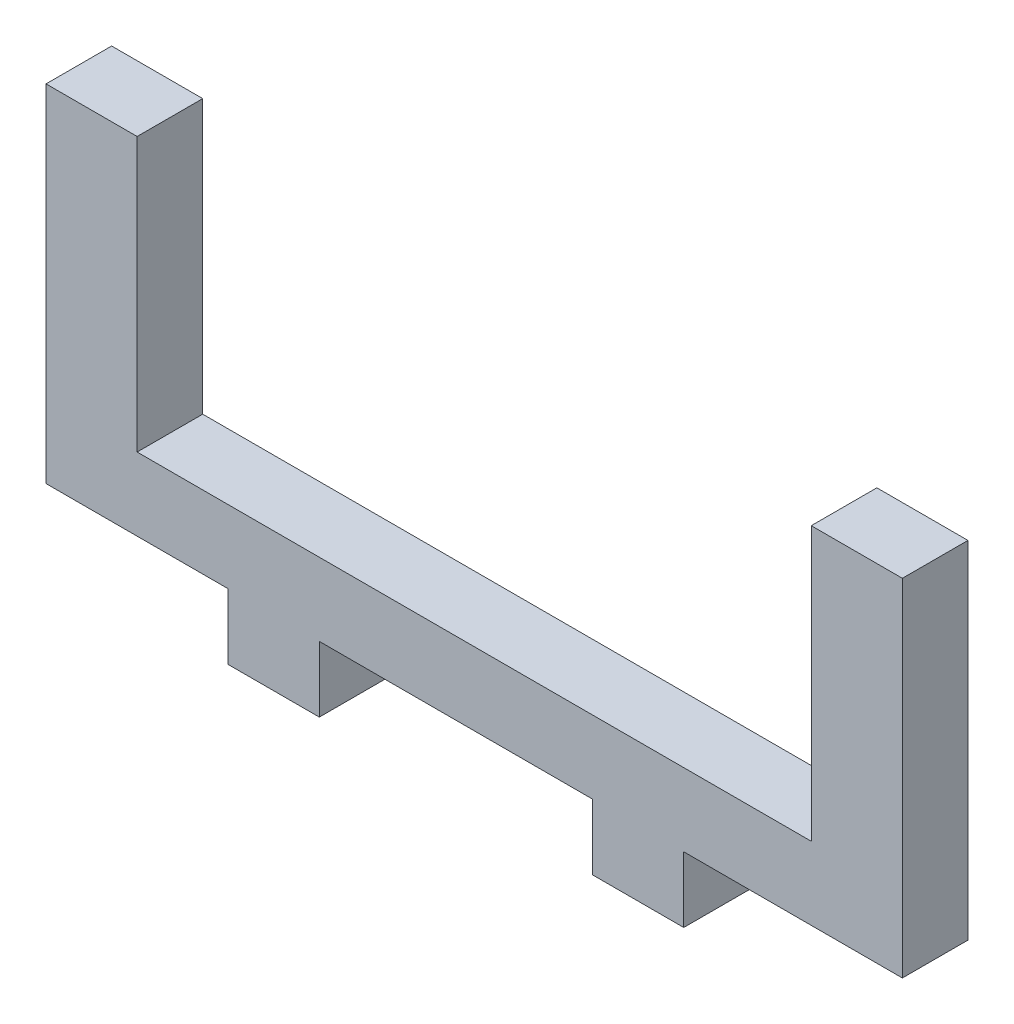
ISO-10303-21;
HEADER;
FILE_DESCRIPTION(('STEP AP214'),'2;1');
FILE_NAME('part.step','',(''),(''),'','','');
FILE_SCHEMA(('AUTOMOTIVE_DESIGN { 1 0 10303 214 1 1 1 1 }'));
ENDSEC;
DATA;
#1=APPLICATION_CONTEXT('core data for automotive mechanical design processes');
#2=APPLICATION_PROTOCOL_DEFINITION('international standard','automotive_design',2000,#1);
#3=PRODUCT_CONTEXT('',#1,'mechanical');
#4=PRODUCT('Part','Part','',(#3));
#5=PRODUCT_RELATED_PRODUCT_CATEGORY('part','',(#4));
#6=PRODUCT_DEFINITION_FORMATION('','',#4);
#7=PRODUCT_DEFINITION_CONTEXT('part definition',#1,'design');
#8=PRODUCT_DEFINITION('design','',#6,#7);
#9=PRODUCT_DEFINITION_SHAPE('','',#8);
#10=(LENGTH_UNIT() NAMED_UNIT(*) SI_UNIT(.MILLI.,.METRE.));
#11=(NAMED_UNIT(*) PLANE_ANGLE_UNIT() SI_UNIT($,.RADIAN.));
#12=(NAMED_UNIT(*) SI_UNIT($,.STERADIAN.) SOLID_ANGLE_UNIT());
#13=UNCERTAINTY_MEASURE_WITH_UNIT(LENGTH_MEASURE(1.E-05),#10,'distance_accuracy_value','');
#14=(GEOMETRIC_REPRESENTATION_CONTEXT(3) GLOBAL_UNCERTAINTY_ASSIGNED_CONTEXT((#13)) GLOBAL_UNIT_ASSIGNED_CONTEXT((#10,
#11,#12)) REPRESENTATION_CONTEXT('',''));
#15=CARTESIAN_POINT('',(0.,0.,0.));
#16=DIRECTION('',(0.,0.,1.));
#17=DIRECTION('',(1.,0.,0.));
#18=AXIS2_PLACEMENT_3D('',#15,#16,#17);
#19=CARTESIAN_POINT('',(0.,-5.08,4.572));
#20=DIRECTION('',(0.,1.,0.));
#21=DIRECTION('',(0.,0.,1.));
#22=AXIS2_PLACEMENT_3D('',#19,#20,#21);
#23=PLANE('',#22);
#24=DIRECTION('',(0.,0.,-1.));
#25=VECTOR('',#24,1.);
#26=CARTESIAN_POINT('',(38.1,-5.08,4.572));
#27=LINE('',#26,#25);
#28=CARTESIAN_POINT('',(38.1,-5.08,4.572));
#29=VERTEX_POINT('',#28);
#30=CARTESIAN_POINT('',(38.1,-5.08,0.));
#31=VERTEX_POINT('',#30);
#32=EDGE_CURVE('E12',#29,#31,#27,.T.);
#33=ORIENTED_EDGE('',*,*,#32,.F.);
#34=DIRECTION('',(1.,0.,0.));
#35=VECTOR('',#34,1.);
#36=CARTESIAN_POINT('',(0.,-5.08,4.572));
#37=LINE('',#36,#35);
#38=CARTESIAN_POINT('',(19.05,-5.08,4.572));
#39=VERTEX_POINT('',#38);
#40=EDGE_CURVE('E246',#39,#29,#37,.T.);
#41=ORIENTED_EDGE('',*,*,#40,.F.);
#42=DIRECTION('',(0.,0.,-1.));
#43=VECTOR('',#42,1.);
#44=CARTESIAN_POINT('',(19.05,-5.08,4.572));
#45=LINE('',#44,#43);
#46=CARTESIAN_POINT('',(19.05,-5.08,0.));
#47=VERTEX_POINT('',#46);
#48=EDGE_CURVE('E162',#39,#47,#45,.T.);
#49=ORIENTED_EDGE('',*,*,#48,.T.);
#50=DIRECTION('',(1.,0.,0.));
#51=VECTOR('',#50,1.);
#52=CARTESIAN_POINT('',(0.,-5.08,0.));
#53=LINE('',#52,#51);
#54=EDGE_CURVE('E212',#47,#31,#53,.T.);
#55=ORIENTED_EDGE('',*,*,#54,.T.);
#56=EDGE_LOOP('',(#33,#41,#49,#55));
#57=FACE_BOUND('',#56,.T.);
#58=ADVANCED_FACE('F83',(#57),#23,.F.);
#59=CARTESIAN_POINT('',(0.,-5.08,4.572));
#60=DIRECTION('',(0.,1.,0.));
#61=DIRECTION('',(0.,0.,1.));
#62=AXIS2_PLACEMENT_3D('',#59,#60,#61);
#63=PLANE('',#62);
#64=DIRECTION('',(1.,0.,0.));
#65=VECTOR('',#64,1.);
#66=CARTESIAN_POINT('',(0.,-5.08,0.));
#67=LINE('',#66,#65);
#68=CARTESIAN_POINT('',(0.,-5.08,0.));
#69=VERTEX_POINT('',#68);
#70=CARTESIAN_POINT('',(12.7,-5.08,0.));
#71=VERTEX_POINT('',#70);
#72=EDGE_CURVE('E140',#69,#71,#67,.T.);
#73=ORIENTED_EDGE('',*,*,#72,.T.);
#74=DIRECTION('',(0.,0.,-1.));
#75=VECTOR('',#74,1.);
#76=CARTESIAN_POINT('',(12.7,-5.08,4.572));
#77=LINE('',#76,#75);
#78=CARTESIAN_POINT('',(12.7,-5.08,4.572));
#79=VERTEX_POINT('',#78);
#80=EDGE_CURVE('E153',#79,#71,#77,.T.);
#81=ORIENTED_EDGE('',*,*,#80,.F.);
#82=DIRECTION('',(1.,0.,0.));
#83=VECTOR('',#82,1.);
#84=CARTESIAN_POINT('',(0.,-5.08,4.572));
#85=LINE('',#84,#83);
#86=CARTESIAN_POINT('',(0.,-5.08,4.572));
#87=VERTEX_POINT('',#86);
#88=EDGE_CURVE('E193',#87,#79,#85,.T.);
#89=ORIENTED_EDGE('',*,*,#88,.F.);
#90=DIRECTION('',(0.,0.,-1.));
#91=VECTOR('',#90,1.);
#92=CARTESIAN_POINT('',(0.,-5.08,4.572));
#93=LINE('',#92,#91);
#94=EDGE_CURVE('E186',#87,#69,#93,.T.);
#95=ORIENTED_EDGE('',*,*,#94,.T.);
#96=EDGE_LOOP('',(#73,#81,#89,#95));
#97=FACE_BOUND('',#96,.T.);
#98=ADVANCED_FACE('F275',(#97),#63,.F.);
#99=CARTESIAN_POINT('',(12.7,0.,4.572));
#100=DIRECTION('',(1.,0.,0.));
#101=DIRECTION('',(0.,0.,-1.));
#102=AXIS2_PLACEMENT_3D('',#99,#100,#101);
#103=PLANE('',#102);
#104=DIRECTION('',(0.,-1.,0.));
#105=VECTOR('',#104,1.);
#106=CARTESIAN_POINT('',(12.7,0.,0.));
#107=LINE('',#106,#105);
#108=CARTESIAN_POINT('',(12.7,-9.652,0.));
#109=VERTEX_POINT('',#108);
#110=EDGE_CURVE('E221',#71,#109,#107,.T.);
#111=ORIENTED_EDGE('',*,*,#110,.T.);
#112=DIRECTION('',(0.,0.,-1.));
#113=VECTOR('',#112,1.);
#114=CARTESIAN_POINT('',(12.7,-9.652,4.572));
#115=LINE('',#114,#113);
#116=CARTESIAN_POINT('',(12.7,-9.652,4.572));
#117=VERTEX_POINT('',#116);
#118=EDGE_CURVE('E156',#117,#109,#115,.T.);
#119=ORIENTED_EDGE('',*,*,#118,.F.);
#120=DIRECTION('',(0.,-1.,0.));
#121=VECTOR('',#120,1.);
#122=CARTESIAN_POINT('',(12.7,0.,4.572));
#123=LINE('',#122,#121);
#124=EDGE_CURVE('E256',#79,#117,#123,.T.);
#125=ORIENTED_EDGE('',*,*,#124,.F.);
#126=ORIENTED_EDGE('',*,*,#80,.T.);
#127=EDGE_LOOP('',(#111,#119,#125,#126));
#128=FACE_BOUND('',#127,.T.);
#129=ADVANCED_FACE('F277',(#128),#103,.F.);
#130=CARTESIAN_POINT('',(0.,-9.652,4.572));
#131=DIRECTION('',(0.,1.,0.));
#132=DIRECTION('',(0.,0.,1.));
#133=AXIS2_PLACEMENT_3D('',#130,#131,#132);
#134=PLANE('',#133);
#135=DIRECTION('',(1.,0.,0.));
#136=VECTOR('',#135,1.);
#137=CARTESIAN_POINT('',(0.,-9.652,0.));
#138=LINE('',#137,#136);
#139=CARTESIAN_POINT('',(19.05,-9.652,0.));
#140=VERTEX_POINT('',#139);
#141=EDGE_CURVE('E218',#109,#140,#138,.T.);
#142=ORIENTED_EDGE('',*,*,#141,.T.);
#143=DIRECTION('',(0.,0.,-1.));
#144=VECTOR('',#143,1.);
#145=CARTESIAN_POINT('',(19.05,-9.652,4.572));
#146=LINE('',#145,#144);
#147=CARTESIAN_POINT('',(19.05,-9.652,4.572));
#148=VERTEX_POINT('',#147);
#149=EDGE_CURVE('E159',#148,#140,#146,.T.);
#150=ORIENTED_EDGE('',*,*,#149,.F.);
#151=DIRECTION('',(1.,0.,0.));
#152=VECTOR('',#151,1.);
#153=CARTESIAN_POINT('',(0.,-9.652,4.572));
#154=LINE('',#153,#152);
#155=EDGE_CURVE('E253',#117,#148,#154,.T.);
#156=ORIENTED_EDGE('',*,*,#155,.F.);
#157=ORIENTED_EDGE('',*,*,#118,.T.);
#158=EDGE_LOOP('',(#142,#150,#156,#157));
#159=FACE_BOUND('',#158,.T.);
#160=ADVANCED_FACE('F381',(#159),#134,.F.);
#161=CARTESIAN_POINT('',(19.05,0.,4.572));
#162=DIRECTION('',(1.,0.,0.));
#163=DIRECTION('',(0.,0.,-1.));
#164=AXIS2_PLACEMENT_3D('',#161,#162,#163);
#165=PLANE('',#164);
#166=DIRECTION('',(0.,-1.,0.));
#167=VECTOR('',#166,1.);
#168=CARTESIAN_POINT('',(19.05,0.,0.));
#169=LINE('',#168,#167);
#170=EDGE_CURVE('E215',#47,#140,#169,.T.);
#171=ORIENTED_EDGE('',*,*,#170,.F.);
#172=ORIENTED_EDGE('',*,*,#48,.F.);
#173=DIRECTION('',(0.,-1.,0.));
#174=VECTOR('',#173,1.);
#175=CARTESIAN_POINT('',(19.05,0.,4.572));
#176=LINE('',#175,#174);
#177=EDGE_CURVE('E250',#39,#148,#176,.T.);
#178=ORIENTED_EDGE('',*,*,#177,.T.);
#179=ORIENTED_EDGE('',*,*,#149,.T.);
#180=EDGE_LOOP('',(#171,#172,#178,#179));
#181=FACE_BOUND('',#180,.T.);
#182=ADVANCED_FACE('F384',(#181),#165,.T.);
#183=CARTESIAN_POINT('',(44.45,-5.08,4.572));
#184=VERTEX_POINT('',#183);
#185=CARTESIAN_POINT('',(59.69,-5.08,4.572));
#186=VERTEX_POINT('',#185);
#187=EDGE_CURVE('E249',#184,#186,#37,.T.);
#188=ORIENTED_EDGE('',*,*,#187,.F.);
#189=DIRECTION('',(0.,0.,-1.));
#190=VECTOR('',#189,1.);
#191=CARTESIAN_POINT('',(44.45,-5.08,4.572));
#192=LINE('',#191,#190);
#193=CARTESIAN_POINT('',(44.45,-5.08,0.));
#194=VERTEX_POINT('',#193);
#195=EDGE_CURVE('E93',#184,#194,#192,.T.);
#196=ORIENTED_EDGE('',*,*,#195,.T.);
#197=CARTESIAN_POINT('',(59.69,-5.08,0.));
#198=VERTEX_POINT('',#197);
#199=EDGE_CURVE('E214',#194,#198,#53,.T.);
#200=ORIENTED_EDGE('',*,*,#199,.T.);
#201=DIRECTION('',(0.,0.,-1.));
#202=VECTOR('',#201,1.);
#203=CARTESIAN_POINT('',(59.69,-5.08,4.572));
#204=LINE('',#203,#202);
#205=EDGE_CURVE('E165',#186,#198,#204,.T.);
#206=ORIENTED_EDGE('',*,*,#205,.F.);
#207=EDGE_LOOP('',(#188,#196,#200,#206));
#208=FACE_BOUND('',#207,.T.);
#209=ADVANCED_FACE('F308',(#208),#23,.F.);
#210=CARTESIAN_POINT('',(59.69,0.,4.572));
#211=DIRECTION('',(1.,0.,0.));
#212=DIRECTION('',(0.,0.,-1.));
#213=AXIS2_PLACEMENT_3D('',#210,#211,#212);
#214=PLANE('',#213);
#215=DIRECTION('',(0.,-1.,0.));
#216=VECTOR('',#215,1.);
#217=CARTESIAN_POINT('',(59.69,0.,0.));
#218=LINE('',#217,#216);
#219=CARTESIAN_POINT('',(59.69,19.05,0.));
#220=VERTEX_POINT('',#219);
#221=EDGE_CURVE('E209',#220,#198,#218,.T.);
#222=ORIENTED_EDGE('',*,*,#221,.F.);
#223=DIRECTION('',(0.,0.,-1.));
#224=VECTOR('',#223,1.);
#225=CARTESIAN_POINT('',(59.69,19.05,4.572));
#226=LINE('',#225,#224);
#227=CARTESIAN_POINT('',(59.69,19.05,4.572));
#228=VERTEX_POINT('',#227);
#229=EDGE_CURVE('E168',#228,#220,#226,.T.);
#230=ORIENTED_EDGE('',*,*,#229,.F.);
#231=DIRECTION('',(0.,-1.,0.));
#232=VECTOR('',#231,1.);
#233=CARTESIAN_POINT('',(59.69,0.,4.572));
#234=LINE('',#233,#232);
#235=EDGE_CURVE('E243',#228,#186,#234,.T.);
#236=ORIENTED_EDGE('',*,*,#235,.T.);
#237=ORIENTED_EDGE('',*,*,#205,.T.);
#238=EDGE_LOOP('',(#222,#230,#236,#237));
#239=FACE_BOUND('',#238,.T.);
#240=ADVANCED_FACE('F315',(#239),#214,.T.);
#241=CARTESIAN_POINT('',(0.,19.05,4.572));
#242=DIRECTION('',(0.,-1.,0.));
#243=DIRECTION('',(0.,0.,-1.));
#244=AXIS2_PLACEMENT_3D('',#241,#242,#243);
#245=PLANE('',#244);
#246=DIRECTION('',(-1.,0.,0.));
#247=VECTOR('',#246,1.);
#248=CARTESIAN_POINT('',(0.,19.05,0.));
#249=LINE('',#248,#247);
#250=CARTESIAN_POINT('',(53.34,19.05,0.));
#251=VERTEX_POINT('',#250);
#252=EDGE_CURVE('E206',#220,#251,#249,.T.);
#253=ORIENTED_EDGE('',*,*,#252,.T.);
#254=DIRECTION('',(0.,0.,-1.));
#255=VECTOR('',#254,1.);
#256=CARTESIAN_POINT('',(53.34,19.05,4.572));
#257=LINE('',#256,#255);
#258=CARTESIAN_POINT('',(53.34,19.05,4.572));
#259=VERTEX_POINT('',#258);
#260=EDGE_CURVE('E171',#259,#251,#257,.T.);
#261=ORIENTED_EDGE('',*,*,#260,.F.);
#262=DIRECTION('',(-1.,0.,0.));
#263=VECTOR('',#262,1.);
#264=CARTESIAN_POINT('',(0.,19.05,4.572));
#265=LINE('',#264,#263);
#266=EDGE_CURVE('E240',#228,#259,#265,.T.);
#267=ORIENTED_EDGE('',*,*,#266,.F.);
#268=ORIENTED_EDGE('',*,*,#229,.T.);
#269=EDGE_LOOP('',(#253,#261,#267,#268));
#270=FACE_BOUND('',#269,.T.);
#271=ADVANCED_FACE('F360',(#270),#245,.F.);
#272=CARTESIAN_POINT('',(53.34,0.,4.572));
#273=DIRECTION('',(-1.,0.,0.));
#274=DIRECTION('',(0.,0.,1.));
#275=AXIS2_PLACEMENT_3D('',#272,#273,#274);
#276=PLANE('',#275);
#277=DIRECTION('',(0.,1.,0.));
#278=VECTOR('',#277,1.);
#279=CARTESIAN_POINT('',(53.34,0.,0.));
#280=LINE('',#279,#278);
#281=CARTESIAN_POINT('',(53.34,0.,0.));
#282=VERTEX_POINT('',#281);
#283=EDGE_CURVE('E203',#282,#251,#280,.T.);
#284=ORIENTED_EDGE('',*,*,#283,.F.);
#285=DIRECTION('',(0.,0.,-1.));
#286=VECTOR('',#285,1.);
#287=CARTESIAN_POINT('',(53.34,0.,4.572));
#288=LINE('',#287,#286);
#289=CARTESIAN_POINT('',(53.34,0.,4.572));
#290=VERTEX_POINT('',#289);
#291=EDGE_CURVE('E174',#290,#282,#288,.T.);
#292=ORIENTED_EDGE('',*,*,#291,.F.);
#293=DIRECTION('',(0.,1.,0.));
#294=VECTOR('',#293,1.);
#295=CARTESIAN_POINT('',(53.34,0.,4.572));
#296=LINE('',#295,#294);
#297=EDGE_CURVE('E237',#290,#259,#296,.T.);
#298=ORIENTED_EDGE('',*,*,#297,.T.);
#299=ORIENTED_EDGE('',*,*,#260,.T.);
#300=EDGE_LOOP('',(#284,#292,#298,#299));
#301=FACE_BOUND('',#300,.T.);
#302=ADVANCED_FACE('F357',(#301),#276,.T.);
#303=CARTESIAN_POINT('',(0.,0.,4.572));
#304=DIRECTION('',(0.,1.,0.));
#305=DIRECTION('',(0.,0.,1.));
#306=AXIS2_PLACEMENT_3D('',#303,#304,#305);
#307=PLANE('',#306);
#308=DIRECTION('',(1.,0.,0.));
#309=VECTOR('',#308,1.);
#310=CARTESIAN_POINT('',(0.,0.,0.));
#311=LINE('',#310,#309);
#312=CARTESIAN_POINT('',(6.35,0.,0.));
#313=VERTEX_POINT('',#312);
#314=EDGE_CURVE('E200',#313,#282,#311,.T.);
#315=ORIENTED_EDGE('',*,*,#314,.F.);
#316=DIRECTION('',(0.,0.,-1.));
#317=VECTOR('',#316,1.);
#318=CARTESIAN_POINT('',(6.35,0.,4.572));
#319=LINE('',#318,#317);
#320=CARTESIAN_POINT('',(6.35,0.,4.572));
#321=VERTEX_POINT('',#320);
#322=EDGE_CURVE('E177',#321,#313,#319,.T.);
#323=ORIENTED_EDGE('',*,*,#322,.F.);
#324=DIRECTION('',(1.,0.,0.));
#325=VECTOR('',#324,1.);
#326=CARTESIAN_POINT('',(0.,0.,4.572));
#327=LINE('',#326,#325);
#328=EDGE_CURVE('E234',#321,#290,#327,.T.);
#329=ORIENTED_EDGE('',*,*,#328,.T.);
#330=ORIENTED_EDGE('',*,*,#291,.T.);
#331=EDGE_LOOP('',(#315,#323,#329,#330));
#332=FACE_BOUND('',#331,.T.);
#333=ADVANCED_FACE('F354',(#332),#307,.T.);
#334=CARTESIAN_POINT('',(6.35,0.,4.572));
#335=DIRECTION('',(-1.,0.,0.));
#336=DIRECTION('',(0.,0.,1.));
#337=AXIS2_PLACEMENT_3D('',#334,#335,#336);
#338=PLANE('',#337);
#339=DIRECTION('',(0.,1.,0.));
#340=VECTOR('',#339,1.);
#341=CARTESIAN_POINT('',(6.35,0.,0.));
#342=LINE('',#341,#340);
#343=CARTESIAN_POINT('',(6.35,19.05,0.));
#344=VERTEX_POINT('',#343);
#345=EDGE_CURVE('E197',#313,#344,#342,.T.);
#346=ORIENTED_EDGE('',*,*,#345,.T.);
#347=DIRECTION('',(0.,0.,-1.));
#348=VECTOR('',#347,1.);
#349=CARTESIAN_POINT('',(6.35,19.05,4.572));
#350=LINE('',#349,#348);
#351=CARTESIAN_POINT('',(6.35,19.05,4.572));
#352=VERTEX_POINT('',#351);
#353=EDGE_CURVE('E180',#352,#344,#350,.T.);
#354=ORIENTED_EDGE('',*,*,#353,.F.);
#355=DIRECTION('',(0.,1.,0.));
#356=VECTOR('',#355,1.);
#357=CARTESIAN_POINT('',(6.35,0.,4.572));
#358=LINE('',#357,#356);
#359=EDGE_CURVE('E231',#321,#352,#358,.T.);
#360=ORIENTED_EDGE('',*,*,#359,.F.);
#361=ORIENTED_EDGE('',*,*,#322,.T.);
#362=EDGE_LOOP('',(#346,#354,#360,#361));
#363=FACE_BOUND('',#362,.T.);
#364=ADVANCED_FACE('F350',(#363),#338,.F.);
#365=CARTESIAN_POINT('',(0.,19.05,4.572));
#366=DIRECTION('',(0.,1.,0.));
#367=DIRECTION('',(0.,0.,1.));
#368=AXIS2_PLACEMENT_3D('',#365,#366,#367);
#369=PLANE('',#368);
#370=DIRECTION('',(1.,0.,0.));
#371=VECTOR('',#370,1.);
#372=CARTESIAN_POINT('',(0.,19.05,0.));
#373=LINE('',#372,#371);
#374=CARTESIAN_POINT('',(0.,19.05,0.));
#375=VERTEX_POINT('',#374);
#376=EDGE_CURVE('E194',#375,#344,#373,.T.);
#377=ORIENTED_EDGE('',*,*,#376,.F.);
#378=DIRECTION('',(0.,0.,-1.));
#379=VECTOR('',#378,1.);
#380=CARTESIAN_POINT('',(0.,19.05,4.572));
#381=LINE('',#380,#379);
#382=CARTESIAN_POINT('',(0.,19.05,4.572));
#383=VERTEX_POINT('',#382);
#384=EDGE_CURVE('E183',#383,#375,#381,.T.);
#385=ORIENTED_EDGE('',*,*,#384,.F.);
#386=DIRECTION('',(1.,0.,0.));
#387=VECTOR('',#386,1.);
#388=CARTESIAN_POINT('',(0.,19.05,4.572));
#389=LINE('',#388,#387);
#390=EDGE_CURVE('E228',#383,#352,#389,.T.);
#391=ORIENTED_EDGE('',*,*,#390,.T.);
#392=ORIENTED_EDGE('',*,*,#353,.T.);
#393=EDGE_LOOP('',(#377,#385,#391,#392));
#394=FACE_BOUND('',#393,.T.);
#395=ADVANCED_FACE('F341',(#394),#369,.T.);
#396=CARTESIAN_POINT('',(0.,0.,4.572));
#397=DIRECTION('',(1.,0.,0.));
#398=DIRECTION('',(0.,1.,0.));
#399=AXIS2_PLACEMENT_3D('',#396,#397,#398);
#400=PLANE('',#399);
#401=DIRECTION('',(0.,-1.,0.));
#402=VECTOR('',#401,1.);
#403=CARTESIAN_POINT('',(0.,0.,0.));
#404=LINE('',#403,#402);
#405=EDGE_CURVE('E190',#375,#69,#404,.T.);
#406=ORIENTED_EDGE('',*,*,#405,.T.);
#407=ORIENTED_EDGE('',*,*,#94,.F.);
#408=DIRECTION('',(0.,-1.,0.));
#409=VECTOR('',#408,1.);
#410=CARTESIAN_POINT('',(0.,0.,4.572));
#411=LINE('',#410,#409);
#412=EDGE_CURVE('E189',#383,#87,#411,.T.);
#413=ORIENTED_EDGE('',*,*,#412,.F.);
#414=ORIENTED_EDGE('',*,*,#384,.T.);
#415=EDGE_LOOP('',(#406,#407,#413,#414));
#416=FACE_BOUND('',#415,.T.);
#417=ADVANCED_FACE('F344',(#416),#400,.F.);
#418=CARTESIAN_POINT('',(0.,0.,4.572));
#419=DIRECTION('',(0.,0.,1.));
#420=DIRECTION('',(1.,0.,0.));
#421=AXIS2_PLACEMENT_3D('',#418,#419,#420);
#422=PLANE('',#421);
#423=ORIENTED_EDGE('',*,*,#88,.T.);
#424=ORIENTED_EDGE('',*,*,#124,.T.);
#425=ORIENTED_EDGE('',*,*,#155,.T.);
#426=ORIENTED_EDGE('',*,*,#177,.F.);
#427=ORIENTED_EDGE('',*,*,#40,.T.);
#428=DIRECTION('',(0.,-1.,0.));
#429=VECTOR('',#428,1.);
#430=CARTESIAN_POINT('',(38.1,-5.08,4.572));
#431=LINE('',#430,#429);
#432=CARTESIAN_POINT('',(38.1,-9.652,4.572));
#433=VERTEX_POINT('',#432);
#434=EDGE_CURVE('E148',#29,#433,#431,.T.);
#435=ORIENTED_EDGE('',*,*,#434,.T.);
#436=DIRECTION('',(1.,0.,0.));
#437=VECTOR('',#436,1.);
#438=CARTESIAN_POINT('',(38.1,-9.652,4.572));
#439=LINE('',#438,#437);
#440=CARTESIAN_POINT('',(44.45,-9.652,4.572));
#441=VERTEX_POINT('',#440);
#442=EDGE_CURVE('E139',#433,#441,#439,.T.);
#443=ORIENTED_EDGE('',*,*,#442,.T.);
#444=DIRECTION('',(0.,-1.,0.));
#445=VECTOR('',#444,1.);
#446=CARTESIAN_POINT('',(44.45,-5.08,4.572));
#447=LINE('',#446,#445);
#448=EDGE_CURVE('E133',#184,#441,#447,.T.);
#449=ORIENTED_EDGE('',*,*,#448,.F.);
#450=ORIENTED_EDGE('',*,*,#187,.T.);
#451=ORIENTED_EDGE('',*,*,#235,.F.);
#452=ORIENTED_EDGE('',*,*,#266,.T.);
#453=ORIENTED_EDGE('',*,*,#297,.F.);
#454=ORIENTED_EDGE('',*,*,#328,.F.);
#455=ORIENTED_EDGE('',*,*,#359,.T.);
#456=ORIENTED_EDGE('',*,*,#390,.F.);
#457=ORIENTED_EDGE('',*,*,#412,.T.);
#458=EDGE_LOOP('',(#423,#424,#425,#426,#427,#435,#443,#449,#450,#451,#452,#453,#454,#455,#456,#457));
#459=FACE_BOUND('',#458,.T.);
#460=ADVANCED_FACE('F264',(#459),#422,.T.);
#461=CARTESIAN_POINT('',(0.,0.,0.));
#462=DIRECTION('',(0.,0.,1.));
#463=DIRECTION('',(1.,0.,0.));
#464=AXIS2_PLACEMENT_3D('',#461,#462,#463);
#465=PLANE('',#464);
#466=ORIENTED_EDGE('',*,*,#72,.F.);
#467=ORIENTED_EDGE('',*,*,#405,.F.);
#468=ORIENTED_EDGE('',*,*,#376,.T.);
#469=ORIENTED_EDGE('',*,*,#345,.F.);
#470=ORIENTED_EDGE('',*,*,#314,.T.);
#471=ORIENTED_EDGE('',*,*,#283,.T.);
#472=ORIENTED_EDGE('',*,*,#252,.F.);
#473=ORIENTED_EDGE('',*,*,#221,.T.);
#474=ORIENTED_EDGE('',*,*,#199,.F.);
#475=DIRECTION('',(0.,-1.,0.));
#476=VECTOR('',#475,1.);
#477=CARTESIAN_POINT('',(44.45,-5.08,0.));
#478=LINE('',#477,#476);
#479=CARTESIAN_POINT('',(44.45,-9.652,0.));
#480=VERTEX_POINT('',#479);
#481=EDGE_CURVE('E144',#194,#480,#478,.T.);
#482=ORIENTED_EDGE('',*,*,#481,.T.);
#483=DIRECTION('',(1.,0.,0.));
#484=VECTOR('',#483,1.);
#485=CARTESIAN_POINT('',(38.1,-9.652,0.));
#486=LINE('',#485,#484);
#487=CARTESIAN_POINT('',(38.1,-9.652,0.));
#488=VERTEX_POINT('',#487);
#489=EDGE_CURVE('E134',#488,#480,#486,.T.);
#490=ORIENTED_EDGE('',*,*,#489,.F.);
#491=DIRECTION('',(0.,-1.,0.));
#492=VECTOR('',#491,1.);
#493=CARTESIAN_POINT('',(38.1,-5.08,0.));
#494=LINE('',#493,#492);
#495=EDGE_CURVE('E122',#31,#488,#494,.T.);
#496=ORIENTED_EDGE('',*,*,#495,.F.);
#497=ORIENTED_EDGE('',*,*,#54,.F.);
#498=ORIENTED_EDGE('',*,*,#170,.T.);
#499=ORIENTED_EDGE('',*,*,#141,.F.);
#500=ORIENTED_EDGE('',*,*,#110,.F.);
#501=EDGE_LOOP('',(#466,#467,#468,#469,#470,#471,#472,#473,#474,#482,#490,#496,#497,#498,#499,#500));
#502=FACE_BOUND('',#501,.T.);
#503=ADVANCED_FACE('F142',(#502),#465,.F.);
#504=CARTESIAN_POINT('',(38.1,-5.08,4.572));
#505=DIRECTION('',(1.,0.,0.));
#506=DIRECTION('',(0.,0.,-1.));
#507=AXIS2_PLACEMENT_3D('',#504,#505,#506);
#508=PLANE('',#507);
#509=ORIENTED_EDGE('',*,*,#495,.T.);
#510=DIRECTION('',(0.,0.,-1.));
#511=VECTOR('',#510,1.);
#512=CARTESIAN_POINT('',(38.1,-9.652,4.572));
#513=LINE('',#512,#511);
#514=EDGE_CURVE('E126',#433,#488,#513,.T.);
#515=ORIENTED_EDGE('',*,*,#514,.F.);
#516=ORIENTED_EDGE('',*,*,#434,.F.);
#517=ORIENTED_EDGE('',*,*,#32,.T.);
#518=EDGE_LOOP('',(#509,#515,#516,#517));
#519=FACE_BOUND('',#518,.T.);
#520=ADVANCED_FACE('F124',(#519),#508,.F.);
#521=CARTESIAN_POINT('',(38.1,-9.652,4.572));
#522=DIRECTION('',(0.,1.,0.));
#523=DIRECTION('',(0.,0.,1.));
#524=AXIS2_PLACEMENT_3D('',#521,#522,#523);
#525=PLANE('',#524);
#526=ORIENTED_EDGE('',*,*,#489,.T.);
#527=DIRECTION('',(0.,0.,-1.));
#528=VECTOR('',#527,1.);
#529=CARTESIAN_POINT('',(44.45,-9.652,4.572));
#530=LINE('',#529,#528);
#531=EDGE_CURVE('E87',#441,#480,#530,.T.);
#532=ORIENTED_EDGE('',*,*,#531,.F.);
#533=ORIENTED_EDGE('',*,*,#442,.F.);
#534=ORIENTED_EDGE('',*,*,#514,.T.);
#535=EDGE_LOOP('',(#526,#532,#533,#534));
#536=FACE_BOUND('',#535,.T.);
#537=ADVANCED_FACE('F137',(#536),#525,.F.);
#538=CARTESIAN_POINT('',(44.45,-5.08,4.572));
#539=DIRECTION('',(1.,0.,0.));
#540=DIRECTION('',(0.,0.,-1.));
#541=AXIS2_PLACEMENT_3D('',#538,#539,#540);
#542=PLANE('',#541);
#543=ORIENTED_EDGE('',*,*,#481,.F.);
#544=ORIENTED_EDGE('',*,*,#195,.F.);
#545=ORIENTED_EDGE('',*,*,#448,.T.);
#546=ORIENTED_EDGE('',*,*,#531,.T.);
#547=EDGE_LOOP('',(#543,#544,#545,#546));
#548=FACE_BOUND('',#547,.T.);
#549=ADVANCED_FACE('F85',(#548),#542,.T.);
#550=CLOSED_SHELL('',(#58,#98,#129,#160,#182,#209,#240,#271,#302,#333,#364,#395,#417,#460,#503,
#520,#537,#549));
#551=MANIFOLD_SOLID_BREP('B2',#550);
#552=ADVANCED_BREP_SHAPE_REPRESENTATION('',(#18,#551),#14);
#553=SHAPE_DEFINITION_REPRESENTATION(#9,#552);
ENDSEC;
END-ISO-10303-21;
